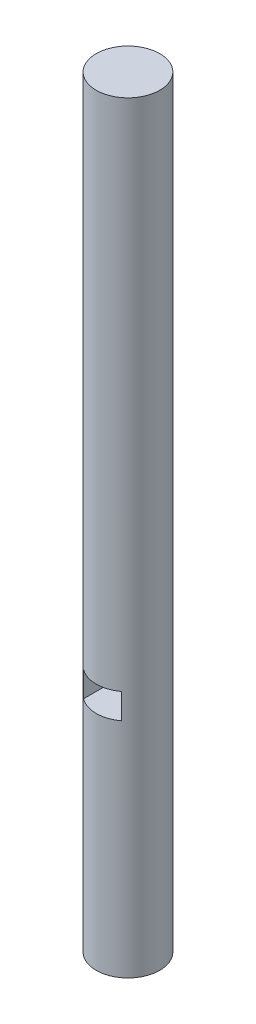
ISO-10303-21;
HEADER;
FILE_DESCRIPTION(('STEP AP214'),'2;1');
FILE_NAME('part.step','',(''),(''),'','','');
FILE_SCHEMA(('AUTOMOTIVE_DESIGN { 1 0 10303 214 1 1 1 1 }'));
ENDSEC;
DATA;
#1=APPLICATION_CONTEXT('core data for automotive mechanical design processes');
#2=APPLICATION_PROTOCOL_DEFINITION('international standard','automotive_design',2000,#1);
#3=PRODUCT_CONTEXT('',#1,'mechanical');
#4=PRODUCT('Part','Part','',(#3));
#5=PRODUCT_RELATED_PRODUCT_CATEGORY('part','',(#4));
#6=PRODUCT_DEFINITION_FORMATION('','',#4);
#7=PRODUCT_DEFINITION_CONTEXT('part definition',#1,'design');
#8=PRODUCT_DEFINITION('design','',#6,#7);
#9=PRODUCT_DEFINITION_SHAPE('','',#8);
#10=(LENGTH_UNIT() NAMED_UNIT(*) SI_UNIT(.MILLI.,.METRE.));
#11=(NAMED_UNIT(*) PLANE_ANGLE_UNIT() SI_UNIT($,.RADIAN.));
#12=(NAMED_UNIT(*) SI_UNIT($,.STERADIAN.) SOLID_ANGLE_UNIT());
#13=UNCERTAINTY_MEASURE_WITH_UNIT(LENGTH_MEASURE(1.E-05),#10,'distance_accuracy_value','');
#14=(GEOMETRIC_REPRESENTATION_CONTEXT(3) GLOBAL_UNCERTAINTY_ASSIGNED_CONTEXT((#13)) GLOBAL_UNIT_ASSIGNED_CONTEXT((#10,
#11,#12)) REPRESENTATION_CONTEXT('',''));
#15=CARTESIAN_POINT('',(0.,0.,0.));
#16=DIRECTION('',(0.,0.,1.));
#17=DIRECTION('',(1.,0.,0.));
#18=AXIS2_PLACEMENT_3D('',#15,#16,#17);
#19=CARTESIAN_POINT('',(0.,120.,0.));
#20=DIRECTION('',(0.,-1.,0.));
#21=DIRECTION('',(0.,0.,-1.));
#22=AXIS2_PLACEMENT_3D('',#19,#20,#21);
#23=CYLINDRICAL_SURFACE('',#22,5.);
#24=CARTESIAN_POINT('',(0.,35.0322534215293,0.));
#25=DIRECTION('',(0.,-1.,0.));
#26=DIRECTION('',(0.,0.,-1.));
#27=AXIS2_PLACEMENT_3D('',#24,#25,#26);
#28=CIRCLE('',#27,5.);
#29=CARTESIAN_POINT('',(3.,35.0322534215293,4.));
#30=VERTEX_POINT('',#29);
#31=CARTESIAN_POINT('',(-3.,35.0322534215293,4.));
#32=VERTEX_POINT('',#31);
#33=EDGE_CURVE('E92',#30,#32,#28,.T.);
#34=ORIENTED_EDGE('',*,*,#33,.T.);
#35=DIRECTION('',(0.,-1.,0.));
#36=VECTOR('',#35,1.);
#37=CARTESIAN_POINT('',(-3.00000000000004,120.,3.99999999999997));
#38=LINE('',#37,#36);
#39=CARTESIAN_POINT('',(-3.,39.0322534215293,4.));
#40=VERTEX_POINT('',#39);
#41=EDGE_CURVE('E11',#32,#40,#38,.F.);
#42=ORIENTED_EDGE('',*,*,#41,.T.);
#43=CARTESIAN_POINT('',(0.,39.0322534215293,0.));
#44=DIRECTION('',(0.,-1.,0.));
#45=DIRECTION('',(0.,0.,-1.));
#46=AXIS2_PLACEMENT_3D('',#43,#44,#45);
#47=CIRCLE('',#46,5.);
#48=CARTESIAN_POINT('',(3.,39.0322534215293,4.));
#49=VERTEX_POINT('',#48);
#50=EDGE_CURVE('E53',#49,#40,#47,.T.);
#51=ORIENTED_EDGE('',*,*,#50,.F.);
#52=DIRECTION('',(0.,-1.,0.));
#53=VECTOR('',#52,1.);
#54=CARTESIAN_POINT('',(3.,120.,4.));
#55=LINE('',#54,#53);
#56=EDGE_CURVE('E108',#30,#49,#55,.F.);
#57=ORIENTED_EDGE('',*,*,#56,.F.);
#58=EDGE_LOOP('',(#34,#42,#51,#57));
#59=FACE_BOUND('',#58,.T.);
#60=CARTESIAN_POINT('',(-3.,39.0322534215293,-4.));
#61=VERTEX_POINT('',#60);
#62=CARTESIAN_POINT('',(3.,39.0322534215293,-4.));
#63=VERTEX_POINT('',#62);
#64=EDGE_CURVE('E103',#61,#63,#47,.T.);
#65=ORIENTED_EDGE('',*,*,#64,.F.);
#66=DIRECTION('',(0.,-1.,0.));
#67=VECTOR('',#66,1.);
#68=CARTESIAN_POINT('',(-3.00000000000004,120.,-3.99999999999997));
#69=LINE('',#68,#67);
#70=CARTESIAN_POINT('',(-3.,35.0322534215293,-4.));
#71=VERTEX_POINT('',#70);
#72=EDGE_CURVE('E96',#61,#71,#69,.T.);
#73=ORIENTED_EDGE('',*,*,#72,.T.);
#74=CARTESIAN_POINT('',(3.,35.0322534215293,-4.));
#75=VERTEX_POINT('',#74);
#76=EDGE_CURVE('E83',#71,#75,#28,.T.);
#77=ORIENTED_EDGE('',*,*,#76,.T.);
#78=DIRECTION('',(0.,-1.,0.));
#79=VECTOR('',#78,1.);
#80=CARTESIAN_POINT('',(3.,120.,-4.));
#81=LINE('',#80,#79);
#82=EDGE_CURVE('E89',#63,#75,#81,.T.);
#83=ORIENTED_EDGE('',*,*,#82,.F.);
#84=EDGE_LOOP('',(#65,#73,#77,#83));
#85=FACE_BOUND('',#84,.T.);
#86=CARTESIAN_POINT('',(0.,120.,0.));
#87=DIRECTION('',(0.,1.,0.));
#88=DIRECTION('',(0.,0.,1.));
#89=AXIS2_PLACEMENT_3D('',#86,#87,#88);
#90=CIRCLE('',#89,5.);
#91=CARTESIAN_POINT('',(0.,120.,5.));
#92=VERTEX_POINT('',#91);
#93=EDGE_CURVE('E90',#92,#92,#90,.T.);
#94=ORIENTED_EDGE('',*,*,#93,.F.);
#95=EDGE_LOOP('',(#94));
#96=FACE_BOUND('',#95,.T.);
#97=CARTESIAN_POINT('',(0.,0.,0.));
#98=DIRECTION('',(0.,1.,0.));
#99=DIRECTION('',(0.,0.,1.));
#100=AXIS2_PLACEMENT_3D('',#97,#98,#99);
#101=CIRCLE('',#100,5.);
#102=CARTESIAN_POINT('',(0.,0.,5.));
#103=VERTEX_POINT('',#102);
#104=EDGE_CURVE('E124',#103,#103,#101,.T.);
#105=ORIENTED_EDGE('',*,*,#104,.T.);
#106=EDGE_LOOP('',(#105));
#107=FACE_BOUND('',#106,.T.);
#108=ADVANCED_FACE('F45',(#59,#85,#96,#107),#23,.T.);
#109=CARTESIAN_POINT('',(0.,120.,0.));
#110=DIRECTION('',(0.,1.,0.));
#111=DIRECTION('',(0.,0.,1.));
#112=AXIS2_PLACEMENT_3D('',#109,#110,#111);
#113=PLANE('',#112);
#114=ORIENTED_EDGE('',*,*,#93,.T.);
#115=EDGE_LOOP('',(#114));
#116=FACE_BOUND('',#115,.T.);
#117=ADVANCED_FACE('F143',(#116),#113,.T.);
#118=CARTESIAN_POINT('',(0.,0.,0.));
#119=DIRECTION('',(0.,1.,0.));
#120=DIRECTION('',(0.,0.,1.));
#121=AXIS2_PLACEMENT_3D('',#118,#119,#120);
#122=PLANE('',#121);
#123=ORIENTED_EDGE('',*,*,#104,.F.);
#124=EDGE_LOOP('',(#123));
#125=FACE_BOUND('',#124,.T.);
#126=ADVANCED_FACE('F141',(#125),#122,.F.);
#127=CARTESIAN_POINT('',(-3.,39.0322534215293,-60.));
#128=DIRECTION('',(-1.,0.,0.));
#129=DIRECTION('',(0.,-1.,0.));
#130=AXIS2_PLACEMENT_3D('',#127,#128,#129);
#131=PLANE('',#130);
#132=DIRECTION('',(0.,0.,1.));
#133=VECTOR('',#132,1.);
#134=CARTESIAN_POINT('',(-3.,39.0322534215293,-60.));
#135=LINE('',#134,#133);
#136=EDGE_CURVE('E120',#61,#40,#135,.T.);
#137=ORIENTED_EDGE('',*,*,#136,.T.);
#138=ORIENTED_EDGE('',*,*,#41,.F.);
#139=DIRECTION('',(0.,0.,1.));
#140=VECTOR('',#139,1.);
#141=CARTESIAN_POINT('',(-3.,35.0322534215293,-60.));
#142=LINE('',#141,#140);
#143=EDGE_CURVE('E60',#71,#32,#142,.T.);
#144=ORIENTED_EDGE('',*,*,#143,.F.);
#145=ORIENTED_EDGE('',*,*,#72,.F.);
#146=EDGE_LOOP('',(#137,#138,#144,#145));
#147=FACE_BOUND('',#146,.T.);
#148=ADVANCED_FACE('F95',(#147),#131,.F.);
#149=CARTESIAN_POINT('',(-3.,39.0322534215293,-60.));
#150=DIRECTION('',(0.,-1.,0.));
#151=DIRECTION('',(0.,0.,-1.));
#152=AXIS2_PLACEMENT_3D('',#149,#150,#151);
#153=PLANE('',#152);
#154=ORIENTED_EDGE('',*,*,#50,.T.);
#155=ORIENTED_EDGE('',*,*,#136,.F.);
#156=ORIENTED_EDGE('',*,*,#64,.T.);
#157=DIRECTION('',(0.,0.,1.));
#158=VECTOR('',#157,1.);
#159=CARTESIAN_POINT('',(3.,39.0322534215293,-60.));
#160=LINE('',#159,#158);
#161=EDGE_CURVE('E121',#63,#49,#160,.T.);
#162=ORIENTED_EDGE('',*,*,#161,.T.);
#163=EDGE_LOOP('',(#154,#155,#156,#162));
#164=FACE_BOUND('',#163,.T.);
#165=ADVANCED_FACE('F119',(#164),#153,.T.);
#166=CARTESIAN_POINT('',(3.,39.0322534215293,-60.));
#167=DIRECTION('',(-1.,0.,0.));
#168=DIRECTION('',(0.,0.,1.));
#169=AXIS2_PLACEMENT_3D('',#166,#167,#168);
#170=PLANE('',#169);
#171=ORIENTED_EDGE('',*,*,#82,.T.);
#172=DIRECTION('',(0.,0.,1.));
#173=VECTOR('',#172,1.);
#174=CARTESIAN_POINT('',(3.,35.0322534215293,-60.));
#175=LINE('',#174,#173);
#176=EDGE_CURVE('E65',#75,#30,#175,.T.);
#177=ORIENTED_EDGE('',*,*,#176,.T.);
#178=ORIENTED_EDGE('',*,*,#56,.T.);
#179=ORIENTED_EDGE('',*,*,#161,.F.);
#180=EDGE_LOOP('',(#171,#177,#178,#179));
#181=FACE_BOUND('',#180,.T.);
#182=ADVANCED_FACE('F126',(#181),#170,.T.);
#183=CARTESIAN_POINT('',(-3.,35.0322534215293,-60.));
#184=DIRECTION('',(0.,-1.,0.));
#185=DIRECTION('',(0.,0.,-1.));
#186=AXIS2_PLACEMENT_3D('',#183,#184,#185);
#187=PLANE('',#186);
#188=ORIENTED_EDGE('',*,*,#176,.F.);
#189=ORIENTED_EDGE('',*,*,#76,.F.);
#190=ORIENTED_EDGE('',*,*,#143,.T.);
#191=ORIENTED_EDGE('',*,*,#33,.F.);
#192=EDGE_LOOP('',(#188,#189,#190,#191));
#193=FACE_BOUND('',#192,.T.);
#194=ADVANCED_FACE('F84',(#193),#187,.F.);
#195=CLOSED_SHELL('',(#108,#117,#126,#148,#165,#182,#194));
#196=MANIFOLD_SOLID_BREP('B2',#195);
#197=ADVANCED_BREP_SHAPE_REPRESENTATION('',(#18,#196),#14);
#198=SHAPE_DEFINITION_REPRESENTATION(#9,#197);
ENDSEC;
END-ISO-10303-21;
